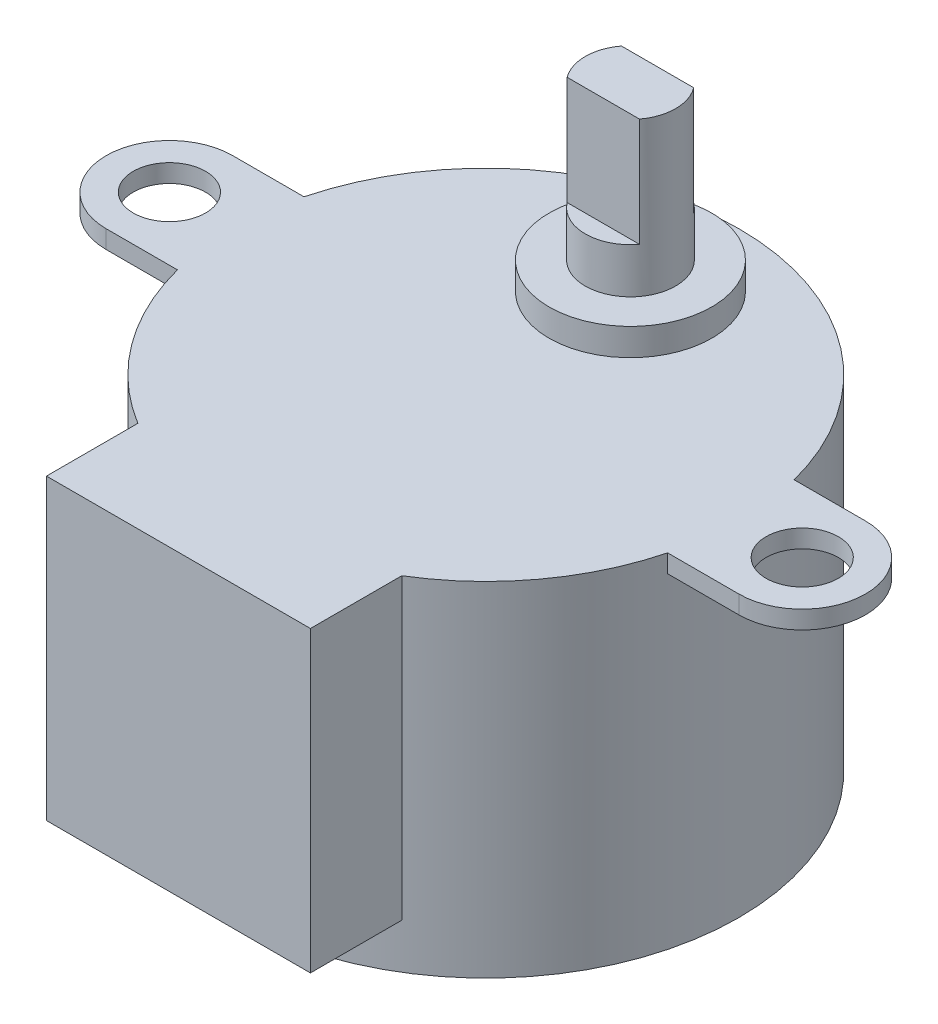
ISO-10303-21;
HEADER;
FILE_DESCRIPTION(('STEP AP214'),'2;1');
FILE_NAME('part.step','',(''),(''),'','','');
FILE_SCHEMA(('AUTOMOTIVE_DESIGN { 1 0 10303 214 1 1 1 1 }'));
ENDSEC;
DATA;
#1=APPLICATION_CONTEXT('core data for automotive mechanical design processes');
#2=APPLICATION_PROTOCOL_DEFINITION('international standard','automotive_design',2000,#1);
#3=PRODUCT_CONTEXT('',#1,'mechanical');
#4=PRODUCT('Part','Part','',(#3));
#5=PRODUCT_RELATED_PRODUCT_CATEGORY('part','',(#4));
#6=PRODUCT_DEFINITION_FORMATION('','',#4);
#7=PRODUCT_DEFINITION_CONTEXT('part definition',#1,'design');
#8=PRODUCT_DEFINITION('design','',#6,#7);
#9=PRODUCT_DEFINITION_SHAPE('','',#8);
#10=(LENGTH_UNIT() NAMED_UNIT(*) SI_UNIT(.MILLI.,.METRE.));
#11=(NAMED_UNIT(*) PLANE_ANGLE_UNIT() SI_UNIT($,.RADIAN.));
#12=(NAMED_UNIT(*) SI_UNIT($,.STERADIAN.) SOLID_ANGLE_UNIT());
#13=UNCERTAINTY_MEASURE_WITH_UNIT(LENGTH_MEASURE(1.E-05),#10,'distance_accuracy_value','');
#14=(GEOMETRIC_REPRESENTATION_CONTEXT(3) GLOBAL_UNCERTAINTY_ASSIGNED_CONTEXT((#13)) GLOBAL_UNIT_ASSIGNED_CONTEXT((#10,
#11,#12)) REPRESENTATION_CONTEXT('',''));
#15=CARTESIAN_POINT('',(0.,0.,0.));
#16=DIRECTION('',(0.,0.,1.));
#17=DIRECTION('',(1.,0.,0.));
#18=AXIS2_PLACEMENT_3D('',#15,#16,#17);
#19=CARTESIAN_POINT('',(0.,19.,0.));
#20=DIRECTION('',(0.,-1.,0.));
#21=DIRECTION('',(0.,0.,-1.));
#22=AXIS2_PLACEMENT_3D('',#19,#20,#21);
#23=CYLINDRICAL_SURFACE('',#22,14.);
#24=CARTESIAN_POINT('',(0.,19.,0.));
#25=DIRECTION('',(0.,1.,0.));
#26=DIRECTION('',(0.,0.,1.));
#27=AXIS2_PLACEMENT_3D('',#24,#25,#26);
#28=CIRCLE('',#27,14.);
#29=CARTESIAN_POINT('',(7.3,19.,11.9461290801665));
#30=VERTEX_POINT('',#29);
#31=CARTESIAN_POINT('',(13.555441711726,19.,3.5));
#32=VERTEX_POINT('',#31);
#33=EDGE_CURVE('E289',#30,#32,#28,.T.);
#34=ORIENTED_EDGE('',*,*,#33,.F.);
#35=DIRECTION('',(0.,1.,0.));
#36=VECTOR('',#35,1.);
#37=CARTESIAN_POINT('',(7.3,2.5,11.9461290801665));
#38=LINE('',#37,#36);
#39=CARTESIAN_POINT('',(7.3,2.5,11.9461290801665));
#40=VERTEX_POINT('',#39);
#41=EDGE_CURVE('E174',#40,#30,#38,.T.);
#42=ORIENTED_EDGE('',*,*,#41,.F.);
#43=CARTESIAN_POINT('',(0.,2.5,0.));
#44=DIRECTION('',(0.,-1.,0.));
#45=DIRECTION('',(0.,0.,1.));
#46=AXIS2_PLACEMENT_3D('',#43,#44,#45);
#47=CIRCLE('',#46,14.);
#48=CARTESIAN_POINT('',(-7.3,2.5,11.9461290801665));
#49=VERTEX_POINT('',#48);
#50=EDGE_CURVE('E166',#40,#49,#47,.T.);
#51=ORIENTED_EDGE('',*,*,#50,.T.);
#52=DIRECTION('',(0.,1.,0.));
#53=VECTOR('',#52,1.);
#54=CARTESIAN_POINT('',(-7.3,2.5,11.9461290801665));
#55=LINE('',#54,#53);
#56=CARTESIAN_POINT('',(-7.3,19.,11.9461290801665));
#57=VERTEX_POINT('',#56);
#58=EDGE_CURVE('E149',#49,#57,#55,.T.);
#59=ORIENTED_EDGE('',*,*,#58,.T.);
#60=CARTESIAN_POINT('',(-13.555441711726,19.,3.5));
#61=VERTEX_POINT('',#60);
#62=EDGE_CURVE('E42',#61,#57,#28,.T.);
#63=ORIENTED_EDGE('',*,*,#62,.F.);
#64=DIRECTION('',(0.,1.,0.));
#65=VECTOR('',#64,1.);
#66=CARTESIAN_POINT('',(-13.555441711726,18.,3.5));
#67=LINE('',#66,#65);
#68=CARTESIAN_POINT('',(-13.555441711726,18.,3.5));
#69=VERTEX_POINT('',#68);
#70=EDGE_CURVE('E253',#69,#61,#67,.T.);
#71=ORIENTED_EDGE('',*,*,#70,.F.);
#72=CARTESIAN_POINT('',(0.,18.,0.));
#73=DIRECTION('',(0.,-1.,0.));
#74=DIRECTION('',(0.,0.,1.));
#75=AXIS2_PLACEMENT_3D('',#72,#73,#74);
#76=CIRCLE('',#75,14.);
#77=CARTESIAN_POINT('',(-13.555441711726,18.,-3.5));
#78=VERTEX_POINT('',#77);
#79=EDGE_CURVE('E234',#69,#78,#76,.T.);
#80=ORIENTED_EDGE('',*,*,#79,.T.);
#81=DIRECTION('',(0.,1.,0.));
#82=VECTOR('',#81,1.);
#83=CARTESIAN_POINT('',(-13.555441711726,18.,-3.5));
#84=LINE('',#83,#82);
#85=CARTESIAN_POINT('',(-13.555441711726,19.,-3.5));
#86=VERTEX_POINT('',#85);
#87=EDGE_CURVE('E250',#78,#86,#84,.T.);
#88=ORIENTED_EDGE('',*,*,#87,.T.);
#89=CARTESIAN_POINT('',(13.555441711726,19.,-3.5));
#90=VERTEX_POINT('',#89);
#91=EDGE_CURVE('E290',#90,#86,#28,.T.);
#92=ORIENTED_EDGE('',*,*,#91,.F.);
#93=DIRECTION('',(0.,1.,0.));
#94=VECTOR('',#93,1.);
#95=CARTESIAN_POINT('',(13.555441711726,18.,-3.5));
#96=LINE('',#95,#94);
#97=CARTESIAN_POINT('',(13.555441711726,18.,-3.5));
#98=VERTEX_POINT('',#97);
#99=EDGE_CURVE('E218',#98,#90,#96,.T.);
#100=ORIENTED_EDGE('',*,*,#99,.F.);
#101=CARTESIAN_POINT('',(0.,18.,0.));
#102=DIRECTION('',(0.,-1.,0.));
#103=DIRECTION('',(0.,0.,-1.));
#104=AXIS2_PLACEMENT_3D('',#101,#102,#103);
#105=CIRCLE('',#104,14.);
#106=CARTESIAN_POINT('',(13.555441711726,18.,3.5));
#107=VERTEX_POINT('',#106);
#108=EDGE_CURVE('E201',#98,#107,#105,.T.);
#109=ORIENTED_EDGE('',*,*,#108,.T.);
#110=DIRECTION('',(0.,1.,0.));
#111=VECTOR('',#110,1.);
#112=CARTESIAN_POINT('',(13.555441711726,18.,3.5));
#113=LINE('',#112,#111);
#114=EDGE_CURVE('E215',#107,#32,#113,.T.);
#115=ORIENTED_EDGE('',*,*,#114,.T.);
#116=EDGE_LOOP('',(#34,#42,#51,#59,#63,#71,#80,#88,#92,#100,#109,#115));
#117=FACE_BOUND('',#116,.T.);
#118=CARTESIAN_POINT('',(0.,0.,0.));
#119=DIRECTION('',(0.,1.,0.));
#120=DIRECTION('',(0.,0.,1.));
#121=AXIS2_PLACEMENT_3D('',#118,#119,#120);
#122=CIRCLE('',#121,14.);
#123=CARTESIAN_POINT('',(0.,0.,14.));
#124=VERTEX_POINT('',#123);
#125=EDGE_CURVE('E37',#124,#124,#122,.T.);
#126=ORIENTED_EDGE('',*,*,#125,.T.);
#127=EDGE_LOOP('',(#126));
#128=FACE_BOUND('',#127,.T.);
#129=ADVANCED_FACE('F34',(#117,#128),#23,.T.);
#130=CARTESIAN_POINT('',(0.,19.,0.));
#131=DIRECTION('',(0.,1.,0.));
#132=DIRECTION('',(0.,0.,1.));
#133=AXIS2_PLACEMENT_3D('',#130,#131,#132);
#134=PLANE('',#133);
#135=CARTESIAN_POINT('',(0.,19.,-8.));
#136=DIRECTION('',(0.,1.,0.));
#137=DIRECTION('',(0.,0.,1.));
#138=AXIS2_PLACEMENT_3D('',#135,#136,#137);
#139=CIRCLE('',#138,4.5);
#140=CARTESIAN_POINT('',(0.,19.,-3.5));
#141=VERTEX_POINT('',#140);
#142=EDGE_CURVE('E283',#141,#141,#139,.T.);
#143=ORIENTED_EDGE('',*,*,#142,.F.);
#144=EDGE_LOOP('',(#143));
#145=FACE_BOUND('',#144,.T.);
#146=ORIENTED_EDGE('',*,*,#62,.T.);
#147=DIRECTION('',(0.,0.,1.));
#148=VECTOR('',#147,1.);
#149=CARTESIAN_POINT('',(-7.3,19.,17.));
#150=LINE('',#149,#148);
#151=CARTESIAN_POINT('',(-7.3,19.,17.));
#152=VERTEX_POINT('',#151);
#153=EDGE_CURVE('E154',#57,#152,#150,.T.);
#154=ORIENTED_EDGE('',*,*,#153,.T.);
#155=DIRECTION('',(1.,0.,0.));
#156=VECTOR('',#155,1.);
#157=CARTESIAN_POINT('',(7.3,19.,17.));
#158=LINE('',#157,#156);
#159=CARTESIAN_POINT('',(7.3,19.,17.));
#160=VERTEX_POINT('',#159);
#161=EDGE_CURVE('E176',#152,#160,#158,.T.);
#162=ORIENTED_EDGE('',*,*,#161,.T.);
#163=DIRECTION('',(0.,0.,-1.));
#164=VECTOR('',#163,1.);
#165=CARTESIAN_POINT('',(7.3,19.,17.));
#166=LINE('',#165,#164);
#167=EDGE_CURVE('E50',#160,#30,#166,.T.);
#168=ORIENTED_EDGE('',*,*,#167,.T.);
#169=ORIENTED_EDGE('',*,*,#33,.T.);
#170=DIRECTION('',(1.,0.,0.));
#171=VECTOR('',#170,1.);
#172=CARTESIAN_POINT('',(17.5,19.,3.5));
#173=LINE('',#172,#171);
#174=CARTESIAN_POINT('',(17.5,19.,3.5));
#175=VERTEX_POINT('',#174);
#176=EDGE_CURVE('E198',#32,#175,#173,.T.);
#177=ORIENTED_EDGE('',*,*,#176,.T.);
#178=CARTESIAN_POINT('',(17.5,19.,0.));
#179=DIRECTION('',(0.,1.,0.));
#180=DIRECTION('',(0.,0.,-1.));
#181=AXIS2_PLACEMENT_3D('',#178,#179,#180);
#182=CIRCLE('',#181,3.5);
#183=CARTESIAN_POINT('',(17.5,19.,-3.5));
#184=VERTEX_POINT('',#183);
#185=EDGE_CURVE('E191',#175,#184,#182,.T.);
#186=ORIENTED_EDGE('',*,*,#185,.T.);
#187=DIRECTION('',(-1.,0.,0.));
#188=VECTOR('',#187,1.);
#189=CARTESIAN_POINT('',(17.5,19.,-3.5));
#190=LINE('',#189,#188);
#191=EDGE_CURVE('E57',#184,#90,#190,.T.);
#192=ORIENTED_EDGE('',*,*,#191,.T.);
#193=ORIENTED_EDGE('',*,*,#91,.T.);
#194=DIRECTION('',(-1.,0.,0.));
#195=VECTOR('',#194,1.);
#196=CARTESIAN_POINT('',(-17.5,19.,-3.5));
#197=LINE('',#196,#195);
#198=CARTESIAN_POINT('',(-17.5,19.,-3.5));
#199=VERTEX_POINT('',#198);
#200=EDGE_CURVE('E231',#86,#199,#197,.T.);
#201=ORIENTED_EDGE('',*,*,#200,.T.);
#202=CARTESIAN_POINT('',(-17.5,19.,0.));
#203=DIRECTION('',(0.,1.,0.));
#204=DIRECTION('',(0.,0.,1.));
#205=AXIS2_PLACEMENT_3D('',#202,#203,#204);
#206=CIRCLE('',#205,3.5);
#207=CARTESIAN_POINT('',(-17.5,19.,3.5));
#208=VERTEX_POINT('',#207);
#209=EDGE_CURVE('E224',#199,#208,#206,.T.);
#210=ORIENTED_EDGE('',*,*,#209,.T.);
#211=DIRECTION('',(1.,0.,0.));
#212=VECTOR('',#211,1.);
#213=CARTESIAN_POINT('',(-17.5,19.,3.5));
#214=LINE('',#213,#212);
#215=EDGE_CURVE('E243',#208,#61,#214,.T.);
#216=ORIENTED_EDGE('',*,*,#215,.T.);
#217=EDGE_LOOP('',(#146,#154,#162,#168,#169,#177,#186,#192,#193,#201,#210,#216));
#218=FACE_BOUND('',#217,.T.);
#219=CARTESIAN_POINT('',(-17.5,19.,0.));
#220=DIRECTION('',(0.,1.,0.));
#221=DIRECTION('',(0.,0.,1.));
#222=AXIS2_PLACEMENT_3D('',#219,#220,#221);
#223=CIRCLE('',#222,2.);
#224=CARTESIAN_POINT('',(-17.5,19.,2.00000000000001));
#225=VERTEX_POINT('',#224);
#226=EDGE_CURVE('E214',#225,#225,#223,.T.);
#227=ORIENTED_EDGE('',*,*,#226,.F.);
#228=EDGE_LOOP('',(#227));
#229=FACE_BOUND('',#228,.T.);
#230=CARTESIAN_POINT('',(17.5,19.,0.));
#231=DIRECTION('',(0.,1.,0.));
#232=DIRECTION('',(0.,0.,-1.));
#233=AXIS2_PLACEMENT_3D('',#230,#231,#232);
#234=CIRCLE('',#233,2.);
#235=CARTESIAN_POINT('',(17.5,19.,-2.));
#236=VERTEX_POINT('',#235);
#237=EDGE_CURVE('E184',#236,#236,#234,.T.);
#238=ORIENTED_EDGE('',*,*,#237,.F.);
#239=EDGE_LOOP('',(#238));
#240=FACE_BOUND('',#239,.T.);
#241=ADVANCED_FACE('F299',(#145,#218,#229,#240),#134,.T.);
#242=CARTESIAN_POINT('',(0.,0.,0.));
#243=DIRECTION('',(0.,1.,0.));
#244=DIRECTION('',(0.,0.,1.));
#245=AXIS2_PLACEMENT_3D('',#242,#243,#244);
#246=PLANE('',#245);
#247=ORIENTED_EDGE('',*,*,#125,.F.);
#248=EDGE_LOOP('',(#247));
#249=FACE_BOUND('',#248,.T.);
#250=ADVANCED_FACE('F296',(#249),#246,.F.);
#251=CARTESIAN_POINT('',(0.,20.5,-8.));
#252=DIRECTION('',(0.,-1.,0.));
#253=DIRECTION('',(0.,0.,-1.));
#254=AXIS2_PLACEMENT_3D('',#251,#252,#253);
#255=CYLINDRICAL_SURFACE('',#254,4.5);
#256=CARTESIAN_POINT('',(0.,20.5,-8.));
#257=DIRECTION('',(0.,1.,0.));
#258=DIRECTION('',(0.,0.,1.));
#259=AXIS2_PLACEMENT_3D('',#256,#257,#258);
#260=CIRCLE('',#259,4.5);
#261=CARTESIAN_POINT('',(0.,20.5,-3.5));
#262=VERTEX_POINT('',#261);
#263=EDGE_CURVE('E285',#262,#262,#260,.T.);
#264=ORIENTED_EDGE('',*,*,#263,.F.);
#265=EDGE_LOOP('',(#264));
#266=FACE_BOUND('',#265,.T.);
#267=ORIENTED_EDGE('',*,*,#142,.T.);
#268=EDGE_LOOP('',(#267));
#269=FACE_BOUND('',#268,.T.);
#270=ADVANCED_FACE('F298',(#266,#269),#255,.T.);
#271=CARTESIAN_POINT('',(0.,20.5,-8.));
#272=DIRECTION('',(0.,1.,0.));
#273=DIRECTION('',(0.,0.,1.));
#274=AXIS2_PLACEMENT_3D('',#271,#272,#273);
#275=PLANE('',#274);
#276=CARTESIAN_POINT('',(0.,20.5,-8.));
#277=DIRECTION('',(0.,1.,0.));
#278=DIRECTION('',(0.,0.,1.));
#279=AXIS2_PLACEMENT_3D('',#276,#277,#278);
#280=CIRCLE('',#279,2.5);
#281=CARTESIAN_POINT('',(0.,20.5,-5.5));
#282=VERTEX_POINT('',#281);
#283=EDGE_CURVE('E11',#282,#282,#280,.T.);
#284=ORIENTED_EDGE('',*,*,#283,.F.);
#285=EDGE_LOOP('',(#284));
#286=FACE_BOUND('',#285,.T.);
#287=ORIENTED_EDGE('',*,*,#263,.T.);
#288=EDGE_LOOP('',(#287));
#289=FACE_BOUND('',#288,.T.);
#290=ADVANCED_FACE('F304',(#286,#289),#275,.T.);
#291=CARTESIAN_POINT('',(0.,29.,-8.));
#292=DIRECTION('',(0.,-1.,0.));
#293=DIRECTION('',(0.,0.,-1.));
#294=AXIS2_PLACEMENT_3D('',#291,#292,#293);
#295=CYLINDRICAL_SURFACE('',#294,2.5);
#296=CARTESIAN_POINT('',(0.,29.,-8.));
#297=DIRECTION('',(0.,1.,0.));
#298=DIRECTION('',(0.,0.,1.));
#299=AXIS2_PLACEMENT_3D('',#296,#297,#298);
#300=CIRCLE('',#299,2.5);
#301=CARTESIAN_POINT('',(-2.,29.,-9.5));
#302=VERTEX_POINT('',#301);
#303=CARTESIAN_POINT('',(-2.,29.,-6.5));
#304=VERTEX_POINT('',#303);
#305=EDGE_CURVE('E269',#302,#304,#300,.T.);
#306=ORIENTED_EDGE('',*,*,#305,.F.);
#307=DIRECTION('',(0.,1.,0.));
#308=VECTOR('',#307,1.);
#309=CARTESIAN_POINT('',(-2.,23.,-9.5));
#310=LINE('',#309,#308);
#311=CARTESIAN_POINT('',(-2.,23.,-9.5));
#312=VERTEX_POINT('',#311);
#313=EDGE_CURVE('E263',#312,#302,#310,.T.);
#314=ORIENTED_EDGE('',*,*,#313,.F.);
#315=CARTESIAN_POINT('',(0.,23.,-8.));
#316=DIRECTION('',(0.,1.,0.));
#317=DIRECTION('',(0.,0.,1.));
#318=AXIS2_PLACEMENT_3D('',#315,#316,#317);
#319=CIRCLE('',#318,2.5);
#320=CARTESIAN_POINT('',(2.,23.,-9.5));
#321=VERTEX_POINT('',#320);
#322=EDGE_CURVE('E257',#321,#312,#319,.T.);
#323=ORIENTED_EDGE('',*,*,#322,.F.);
#324=DIRECTION('',(0.,1.,0.));
#325=VECTOR('',#324,1.);
#326=CARTESIAN_POINT('',(2.,23.,-9.5));
#327=LINE('',#326,#325);
#328=CARTESIAN_POINT('',(2.,29.,-9.5));
#329=VERTEX_POINT('',#328);
#330=EDGE_CURVE('E266',#321,#329,#327,.T.);
#331=ORIENTED_EDGE('',*,*,#330,.T.);
#332=CARTESIAN_POINT('',(2.,29.,-6.5));
#333=VERTEX_POINT('',#332);
#334=EDGE_CURVE('E281',#333,#329,#300,.T.);
#335=ORIENTED_EDGE('',*,*,#334,.F.);
#336=DIRECTION('',(0.,1.,0.));
#337=VECTOR('',#336,1.);
#338=CARTESIAN_POINT('',(2.,23.,-6.5));
#339=LINE('',#338,#337);
#340=CARTESIAN_POINT('',(2.,23.,-6.5));
#341=VERTEX_POINT('',#340);
#342=EDGE_CURVE('E276',#341,#333,#339,.T.);
#343=ORIENTED_EDGE('',*,*,#342,.F.);
#344=CARTESIAN_POINT('',(0.,23.,-8.));
#345=DIRECTION('',(0.,1.,0.));
#346=DIRECTION('',(0.,0.,1.));
#347=AXIS2_PLACEMENT_3D('',#344,#345,#346);
#348=CIRCLE('',#347,2.5);
#349=CARTESIAN_POINT('',(-2.,23.,-6.5));
#350=VERTEX_POINT('',#349);
#351=EDGE_CURVE('E271',#350,#341,#348,.T.);
#352=ORIENTED_EDGE('',*,*,#351,.F.);
#353=DIRECTION('',(0.,1.,0.));
#354=VECTOR('',#353,1.);
#355=CARTESIAN_POINT('',(-2.,23.,-6.5));
#356=LINE('',#355,#354);
#357=EDGE_CURVE('E265',#350,#304,#356,.T.);
#358=ORIENTED_EDGE('',*,*,#357,.T.);
#359=EDGE_LOOP('',(#306,#314,#323,#331,#335,#343,#352,#358));
#360=FACE_BOUND('',#359,.T.);
#361=ORIENTED_EDGE('',*,*,#283,.T.);
#362=EDGE_LOOP('',(#361));
#363=FACE_BOUND('',#362,.T.);
#364=ADVANCED_FACE('F419',(#360,#363),#295,.T.);
#365=CARTESIAN_POINT('',(0.,29.,-8.));
#366=DIRECTION('',(0.,1.,0.));
#367=DIRECTION('',(0.,0.,1.));
#368=AXIS2_PLACEMENT_3D('',#365,#366,#367);
#369=PLANE('',#368);
#370=DIRECTION('',(1.,0.,0.));
#371=VECTOR('',#370,1.);
#372=CARTESIAN_POINT('',(-2.,29.,-9.5));
#373=LINE('',#372,#371);
#374=EDGE_CURVE('E260',#302,#329,#373,.T.);
#375=ORIENTED_EDGE('',*,*,#374,.F.);
#376=ORIENTED_EDGE('',*,*,#305,.T.);
#377=DIRECTION('',(-1.,0.,0.));
#378=VECTOR('',#377,1.);
#379=CARTESIAN_POINT('',(-2.,29.,-6.5));
#380=LINE('',#379,#378);
#381=EDGE_CURVE('E249',#333,#304,#380,.T.);
#382=ORIENTED_EDGE('',*,*,#381,.F.);
#383=ORIENTED_EDGE('',*,*,#334,.T.);
#384=EDGE_LOOP('',(#375,#376,#382,#383));
#385=FACE_BOUND('',#384,.T.);
#386=ADVANCED_FACE('F415',(#385),#369,.T.);
#387=CARTESIAN_POINT('',(-2.,23.,-6.5));
#388=DIRECTION('',(0.,0.,-1.));
#389=DIRECTION('',(-1.,0.,0.));
#390=AXIS2_PLACEMENT_3D('',#387,#388,#389);
#391=PLANE('',#390);
#392=ORIENTED_EDGE('',*,*,#381,.T.);
#393=ORIENTED_EDGE('',*,*,#357,.F.);
#394=DIRECTION('',(-1.,0.,0.));
#395=VECTOR('',#394,1.);
#396=CARTESIAN_POINT('',(-2.,23.,-6.5));
#397=LINE('',#396,#395);
#398=EDGE_CURVE('E273',#341,#350,#397,.T.);
#399=ORIENTED_EDGE('',*,*,#398,.F.);
#400=ORIENTED_EDGE('',*,*,#342,.T.);
#401=EDGE_LOOP('',(#392,#393,#399,#400));
#402=FACE_BOUND('',#401,.T.);
#403=ADVANCED_FACE('F411',(#402),#391,.F.);
#404=CARTESIAN_POINT('',(0.,23.,-8.));
#405=DIRECTION('',(0.,1.,0.));
#406=DIRECTION('',(0.,0.,1.));
#407=AXIS2_PLACEMENT_3D('',#404,#405,#406);
#408=PLANE('',#407);
#409=ORIENTED_EDGE('',*,*,#351,.T.);
#410=ORIENTED_EDGE('',*,*,#398,.T.);
#411=EDGE_LOOP('',(#409,#410));
#412=FACE_BOUND('',#411,.T.);
#413=ADVANCED_FACE('F407',(#412),#408,.T.);
#414=CARTESIAN_POINT('',(-2.,23.,-9.5));
#415=DIRECTION('',(0.,0.,1.));
#416=DIRECTION('',(1.,0.,0.));
#417=AXIS2_PLACEMENT_3D('',#414,#415,#416);
#418=PLANE('',#417);
#419=ORIENTED_EDGE('',*,*,#374,.T.);
#420=ORIENTED_EDGE('',*,*,#330,.F.);
#421=DIRECTION('',(1.,0.,0.));
#422=VECTOR('',#421,1.);
#423=CARTESIAN_POINT('',(-2.,23.,-9.5));
#424=LINE('',#423,#422);
#425=EDGE_CURVE('E259',#312,#321,#424,.T.);
#426=ORIENTED_EDGE('',*,*,#425,.F.);
#427=ORIENTED_EDGE('',*,*,#313,.T.);
#428=EDGE_LOOP('',(#419,#420,#426,#427));
#429=FACE_BOUND('',#428,.T.);
#430=ADVANCED_FACE('F403',(#429),#418,.F.);
#431=CARTESIAN_POINT('',(0.,23.,-8.));
#432=DIRECTION('',(0.,1.,0.));
#433=DIRECTION('',(0.,0.,1.));
#434=AXIS2_PLACEMENT_3D('',#431,#432,#433);
#435=PLANE('',#434);
#436=ORIENTED_EDGE('',*,*,#322,.T.);
#437=ORIENTED_EDGE('',*,*,#425,.T.);
#438=EDGE_LOOP('',(#436,#437));
#439=FACE_BOUND('',#438,.T.);
#440=ADVANCED_FACE('F399',(#439),#435,.T.);
#441=CARTESIAN_POINT('',(-17.5,18.,0.));
#442=DIRECTION('',(0.,1.,0.));
#443=DIRECTION('',(0.,0.,1.));
#444=AXIS2_PLACEMENT_3D('',#441,#442,#443);
#445=CYLINDRICAL_SURFACE('',#444,3.5);
#446=ORIENTED_EDGE('',*,*,#209,.F.);
#447=DIRECTION('',(0.,1.,0.));
#448=VECTOR('',#447,1.);
#449=CARTESIAN_POINT('',(-17.5,18.,-3.5));
#450=LINE('',#449,#448);
#451=CARTESIAN_POINT('',(-17.5,18.,-3.5));
#452=VERTEX_POINT('',#451);
#453=EDGE_CURVE('E247',#452,#199,#450,.T.);
#454=ORIENTED_EDGE('',*,*,#453,.F.);
#455=CARTESIAN_POINT('',(-17.5,18.,0.));
#456=DIRECTION('',(0.,1.,0.));
#457=DIRECTION('',(0.,0.,1.));
#458=AXIS2_PLACEMENT_3D('',#455,#456,#457);
#459=CIRCLE('',#458,3.5);
#460=CARTESIAN_POINT('',(-17.5,18.,3.5));
#461=VERTEX_POINT('',#460);
#462=EDGE_CURVE('E227',#452,#461,#459,.T.);
#463=ORIENTED_EDGE('',*,*,#462,.T.);
#464=DIRECTION('',(0.,1.,0.));
#465=VECTOR('',#464,1.);
#466=CARTESIAN_POINT('',(-17.5,18.,3.5));
#467=LINE('',#466,#465);
#468=EDGE_CURVE('E240',#461,#208,#467,.T.);
#469=ORIENTED_EDGE('',*,*,#468,.T.);
#470=EDGE_LOOP('',(#446,#454,#463,#469));
#471=FACE_BOUND('',#470,.T.);
#472=ADVANCED_FACE('F392',(#471),#445,.T.);
#473=CARTESIAN_POINT('',(-17.5,18.,-3.5));
#474=DIRECTION('',(0.,0.,-1.));
#475=DIRECTION('',(-1.,0.,0.));
#476=AXIS2_PLACEMENT_3D('',#473,#474,#475);
#477=PLANE('',#476);
#478=ORIENTED_EDGE('',*,*,#200,.F.);
#479=ORIENTED_EDGE('',*,*,#87,.F.);
#480=DIRECTION('',(-1.,0.,0.));
#481=VECTOR('',#480,1.);
#482=CARTESIAN_POINT('',(-17.5,18.,-3.5));
#483=LINE('',#482,#481);
#484=EDGE_CURVE('E237',#78,#452,#483,.T.);
#485=ORIENTED_EDGE('',*,*,#484,.T.);
#486=ORIENTED_EDGE('',*,*,#453,.T.);
#487=EDGE_LOOP('',(#478,#479,#485,#486));
#488=FACE_BOUND('',#487,.T.);
#489=ADVANCED_FACE('F389',(#488),#477,.T.);
#490=CARTESIAN_POINT('',(-17.5,18.,3.5));
#491=DIRECTION('',(0.,0.,1.));
#492=DIRECTION('',(1.,0.,0.));
#493=AXIS2_PLACEMENT_3D('',#490,#491,#492);
#494=PLANE('',#493);
#495=ORIENTED_EDGE('',*,*,#215,.F.);
#496=ORIENTED_EDGE('',*,*,#468,.F.);
#497=DIRECTION('',(1.,0.,0.));
#498=VECTOR('',#497,1.);
#499=CARTESIAN_POINT('',(-17.5,18.,3.5));
#500=LINE('',#499,#498);
#501=EDGE_CURVE('E230',#461,#69,#500,.T.);
#502=ORIENTED_EDGE('',*,*,#501,.T.);
#503=ORIENTED_EDGE('',*,*,#70,.T.);
#504=EDGE_LOOP('',(#495,#496,#502,#503));
#505=FACE_BOUND('',#504,.T.);
#506=ADVANCED_FACE('F387',(#505),#494,.T.);
#507=CARTESIAN_POINT('',(-17.5,18.,0.));
#508=DIRECTION('',(0.,1.,0.));
#509=DIRECTION('',(0.,0.,1.));
#510=AXIS2_PLACEMENT_3D('',#507,#508,#509);
#511=PLANE('',#510);
#512=CARTESIAN_POINT('',(-17.5,18.,0.));
#513=DIRECTION('',(0.,1.,0.));
#514=DIRECTION('',(0.,0.,1.));
#515=AXIS2_PLACEMENT_3D('',#512,#513,#514);
#516=CIRCLE('',#515,2.);
#517=CARTESIAN_POINT('',(-17.5,18.,2.00000000000001));
#518=VERTEX_POINT('',#517);
#519=EDGE_CURVE('E221',#518,#518,#516,.T.);
#520=ORIENTED_EDGE('',*,*,#519,.T.);
#521=EDGE_LOOP('',(#520));
#522=FACE_BOUND('',#521,.T.);
#523=ORIENTED_EDGE('',*,*,#462,.F.);
#524=ORIENTED_EDGE('',*,*,#484,.F.);
#525=ORIENTED_EDGE('',*,*,#79,.F.);
#526=ORIENTED_EDGE('',*,*,#501,.F.);
#527=EDGE_LOOP('',(#523,#524,#525,#526));
#528=FACE_BOUND('',#527,.T.);
#529=ADVANCED_FACE('F383',(#522,#528),#511,.F.);
#530=CARTESIAN_POINT('',(-17.5,18.,0.));
#531=DIRECTION('',(0.,1.,0.));
#532=DIRECTION('',(0.,0.,1.));
#533=AXIS2_PLACEMENT_3D('',#530,#531,#532);
#534=CYLINDRICAL_SURFACE('',#533,2.);
#535=ORIENTED_EDGE('',*,*,#519,.F.);
#536=EDGE_LOOP('',(#535));
#537=FACE_BOUND('',#536,.T.);
#538=ORIENTED_EDGE('',*,*,#226,.T.);
#539=EDGE_LOOP('',(#538));
#540=FACE_BOUND('',#539,.T.);
#541=ADVANCED_FACE('F379',(#537,#540),#534,.F.);
#542=CARTESIAN_POINT('',(17.5,18.,0.));
#543=DIRECTION('',(0.,1.,0.));
#544=DIRECTION('',(0.,0.,1.));
#545=AXIS2_PLACEMENT_3D('',#542,#543,#544);
#546=CYLINDRICAL_SURFACE('',#545,3.5);
#547=ORIENTED_EDGE('',*,*,#185,.F.);
#548=DIRECTION('',(0.,1.,0.));
#549=VECTOR('',#548,1.);
#550=CARTESIAN_POINT('',(17.5,18.,3.5));
#551=LINE('',#550,#549);
#552=CARTESIAN_POINT('',(17.5,18.,3.5));
#553=VERTEX_POINT('',#552);
#554=EDGE_CURVE('E212',#553,#175,#551,.T.);
#555=ORIENTED_EDGE('',*,*,#554,.F.);
#556=CARTESIAN_POINT('',(17.5,18.,0.));
#557=DIRECTION('',(0.,1.,0.));
#558=DIRECTION('',(0.,0.,-1.));
#559=AXIS2_PLACEMENT_3D('',#556,#557,#558);
#560=CIRCLE('',#559,3.5);
#561=CARTESIAN_POINT('',(17.5,18.,-3.5));
#562=VERTEX_POINT('',#561);
#563=EDGE_CURVE('E194',#553,#562,#560,.T.);
#564=ORIENTED_EDGE('',*,*,#563,.T.);
#565=DIRECTION('',(0.,1.,0.));
#566=VECTOR('',#565,1.);
#567=CARTESIAN_POINT('',(17.5,18.,-3.5));
#568=LINE('',#567,#566);
#569=EDGE_CURVE('E207',#562,#184,#568,.T.);
#570=ORIENTED_EDGE('',*,*,#569,.T.);
#571=EDGE_LOOP('',(#547,#555,#564,#570));
#572=FACE_BOUND('',#571,.T.);
#573=ADVANCED_FACE('F372',(#572),#546,.T.);
#574=CARTESIAN_POINT('',(17.5,18.,3.5));
#575=DIRECTION('',(0.,0.,1.));
#576=DIRECTION('',(1.,0.,0.));
#577=AXIS2_PLACEMENT_3D('',#574,#575,#576);
#578=PLANE('',#577);
#579=ORIENTED_EDGE('',*,*,#176,.F.);
#580=ORIENTED_EDGE('',*,*,#114,.F.);
#581=DIRECTION('',(1.,0.,0.));
#582=VECTOR('',#581,1.);
#583=CARTESIAN_POINT('',(17.5,18.,3.5));
#584=LINE('',#583,#582);
#585=EDGE_CURVE('E204',#107,#553,#584,.T.);
#586=ORIENTED_EDGE('',*,*,#585,.T.);
#587=ORIENTED_EDGE('',*,*,#554,.T.);
#588=EDGE_LOOP('',(#579,#580,#586,#587));
#589=FACE_BOUND('',#588,.T.);
#590=ADVANCED_FACE('F369',(#589),#578,.T.);
#591=CARTESIAN_POINT('',(17.5,18.,-3.5));
#592=DIRECTION('',(0.,0.,-1.));
#593=DIRECTION('',(-1.,0.,0.));
#594=AXIS2_PLACEMENT_3D('',#591,#592,#593);
#595=PLANE('',#594);
#596=ORIENTED_EDGE('',*,*,#191,.F.);
#597=ORIENTED_EDGE('',*,*,#569,.F.);
#598=DIRECTION('',(-1.,0.,0.));
#599=VECTOR('',#598,1.);
#600=CARTESIAN_POINT('',(17.5,18.,-3.5));
#601=LINE('',#600,#599);
#602=EDGE_CURVE('E197',#562,#98,#601,.T.);
#603=ORIENTED_EDGE('',*,*,#602,.T.);
#604=ORIENTED_EDGE('',*,*,#99,.T.);
#605=EDGE_LOOP('',(#596,#597,#603,#604));
#606=FACE_BOUND('',#605,.T.);
#607=ADVANCED_FACE('F367',(#606),#595,.T.);
#608=CARTESIAN_POINT('',(17.5,18.,0.));
#609=DIRECTION('',(0.,-1.,0.));
#610=DIRECTION('',(0.,0.,-1.));
#611=AXIS2_PLACEMENT_3D('',#608,#609,#610);
#612=PLANE('',#611);
#613=CARTESIAN_POINT('',(17.5,18.,0.));
#614=DIRECTION('',(0.,1.,0.));
#615=DIRECTION('',(0.,0.,-1.));
#616=AXIS2_PLACEMENT_3D('',#613,#614,#615);
#617=CIRCLE('',#616,2.);
#618=CARTESIAN_POINT('',(17.5,18.,-2.));
#619=VERTEX_POINT('',#618);
#620=EDGE_CURVE('E188',#619,#619,#617,.T.);
#621=ORIENTED_EDGE('',*,*,#620,.T.);
#622=EDGE_LOOP('',(#621));
#623=FACE_BOUND('',#622,.T.);
#624=ORIENTED_EDGE('',*,*,#563,.F.);
#625=ORIENTED_EDGE('',*,*,#585,.F.);
#626=ORIENTED_EDGE('',*,*,#108,.F.);
#627=ORIENTED_EDGE('',*,*,#602,.F.);
#628=EDGE_LOOP('',(#624,#625,#626,#627));
#629=FACE_BOUND('',#628,.T.);
#630=ADVANCED_FACE('F363',(#623,#629),#612,.T.);
#631=CARTESIAN_POINT('',(17.5,18.,0.));
#632=DIRECTION('',(0.,1.,0.));
#633=DIRECTION('',(0.,0.,1.));
#634=AXIS2_PLACEMENT_3D('',#631,#632,#633);
#635=CYLINDRICAL_SURFACE('',#634,2.);
#636=ORIENTED_EDGE('',*,*,#620,.F.);
#637=EDGE_LOOP('',(#636));
#638=FACE_BOUND('',#637,.T.);
#639=ORIENTED_EDGE('',*,*,#237,.T.);
#640=EDGE_LOOP('',(#639));
#641=FACE_BOUND('',#640,.T.);
#642=ADVANCED_FACE('F330',(#638,#641),#635,.F.);
#643=CARTESIAN_POINT('',(7.3,2.5,17.));
#644=DIRECTION('',(1.,0.,0.));
#645=DIRECTION('',(0.,0.,-1.));
#646=AXIS2_PLACEMENT_3D('',#643,#644,#645);
#647=PLANE('',#646);
#648=ORIENTED_EDGE('',*,*,#167,.F.);
#649=DIRECTION('',(0.,1.,0.));
#650=VECTOR('',#649,1.);
#651=CARTESIAN_POINT('',(7.3,2.5,17.));
#652=LINE('',#651,#650);
#653=CARTESIAN_POINT('',(7.3,2.5,17.));
#654=VERTEX_POINT('',#653);
#655=EDGE_CURVE('E185',#654,#160,#652,.T.);
#656=ORIENTED_EDGE('',*,*,#655,.F.);
#657=DIRECTION('',(0.,0.,-1.));
#658=VECTOR('',#657,1.);
#659=CARTESIAN_POINT('',(7.3,2.5,17.));
#660=LINE('',#659,#658);
#661=EDGE_CURVE('E160',#654,#40,#660,.T.);
#662=ORIENTED_EDGE('',*,*,#661,.T.);
#663=ORIENTED_EDGE('',*,*,#41,.T.);
#664=EDGE_LOOP('',(#648,#656,#662,#663));
#665=FACE_BOUND('',#664,.T.);
#666=ADVANCED_FACE('F325',(#665),#647,.T.);
#667=CARTESIAN_POINT('',(7.3,2.5,17.));
#668=DIRECTION('',(0.,0.,1.));
#669=DIRECTION('',(1.,0.,0.));
#670=AXIS2_PLACEMENT_3D('',#667,#668,#669);
#671=PLANE('',#670);
#672=ORIENTED_EDGE('',*,*,#161,.F.);
#673=DIRECTION('',(0.,1.,0.));
#674=VECTOR('',#673,1.);
#675=CARTESIAN_POINT('',(-7.3,2.5,17.));
#676=LINE('',#675,#674);
#677=CARTESIAN_POINT('',(-7.3,2.5,17.));
#678=VERTEX_POINT('',#677);
#679=EDGE_CURVE('E159',#678,#152,#676,.T.);
#680=ORIENTED_EDGE('',*,*,#679,.F.);
#681=DIRECTION('',(1.,0.,0.));
#682=VECTOR('',#681,1.);
#683=CARTESIAN_POINT('',(7.3,2.5,17.));
#684=LINE('',#683,#682);
#685=EDGE_CURVE('E169',#678,#654,#684,.T.);
#686=ORIENTED_EDGE('',*,*,#685,.T.);
#687=ORIENTED_EDGE('',*,*,#655,.T.);
#688=EDGE_LOOP('',(#672,#680,#686,#687));
#689=FACE_BOUND('',#688,.T.);
#690=ADVANCED_FACE('F329',(#689),#671,.T.);
#691=CARTESIAN_POINT('',(-7.3,2.5,17.));
#692=DIRECTION('',(-1.,0.,0.));
#693=DIRECTION('',(0.,0.,1.));
#694=AXIS2_PLACEMENT_3D('',#691,#692,#693);
#695=PLANE('',#694);
#696=ORIENTED_EDGE('',*,*,#153,.F.);
#697=ORIENTED_EDGE('',*,*,#58,.F.);
#698=DIRECTION('',(0.,0.,1.));
#699=VECTOR('',#698,1.);
#700=CARTESIAN_POINT('',(-7.3,2.5,17.));
#701=LINE('',#700,#699);
#702=EDGE_CURVE('E152',#49,#678,#701,.T.);
#703=ORIENTED_EDGE('',*,*,#702,.T.);
#704=ORIENTED_EDGE('',*,*,#679,.T.);
#705=EDGE_LOOP('',(#696,#697,#703,#704));
#706=FACE_BOUND('',#705,.T.);
#707=ADVANCED_FACE('F151',(#706),#695,.T.);
#708=CARTESIAN_POINT('',(0.,2.5,0.));
#709=DIRECTION('',(0.,1.,0.));
#710=DIRECTION('',(0.,0.,1.));
#711=AXIS2_PLACEMENT_3D('',#708,#709,#710);
#712=PLANE('',#711);
#713=ORIENTED_EDGE('',*,*,#50,.F.);
#714=ORIENTED_EDGE('',*,*,#661,.F.);
#715=ORIENTED_EDGE('',*,*,#685,.F.);
#716=ORIENTED_EDGE('',*,*,#702,.F.);
#717=EDGE_LOOP('',(#713,#714,#715,#716));
#718=FACE_BOUND('',#717,.T.);
#719=ADVANCED_FACE('F164',(#718),#712,.F.);
#720=CLOSED_SHELL('',(#129,#241,#250,#270,#290,#364,#386,#403,#413,#430,#440,#472,#489,#506,
#529,#541,#573,#590,#607,#630,#642,#666,#690,#707,#719));
#721=MANIFOLD_SOLID_BREP('B2',#720);
#722=ADVANCED_BREP_SHAPE_REPRESENTATION('',(#18,#721),#14);
#723=SHAPE_DEFINITION_REPRESENTATION(#9,#722);
ENDSEC;
END-ISO-10303-21;
